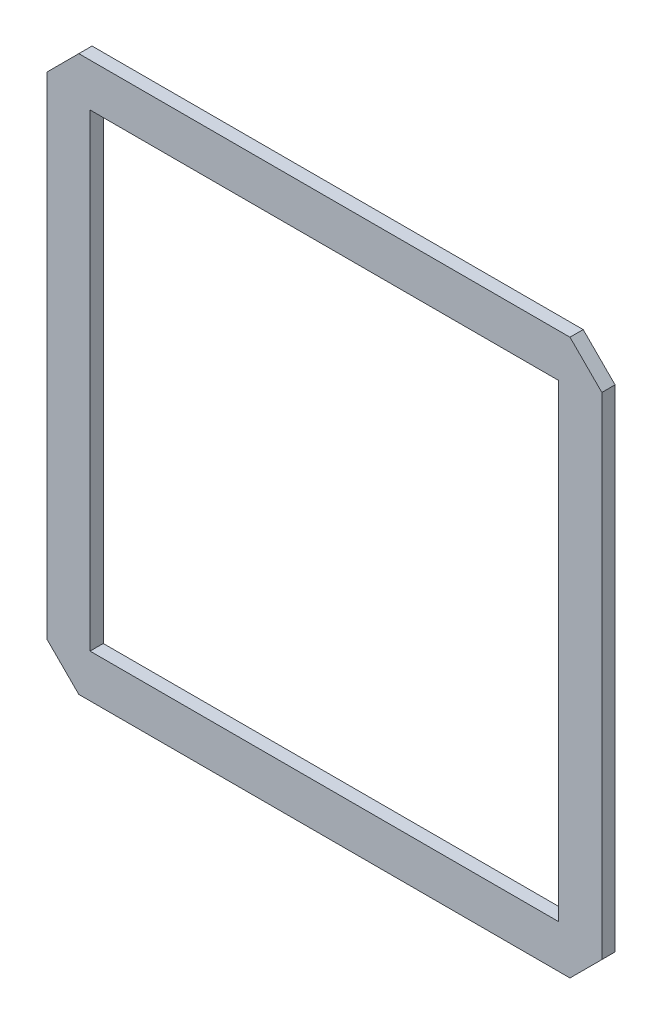
ISO-10303-21;
HEADER;
FILE_DESCRIPTION(('STEP AP214'),'2;1');
FILE_NAME('part.step','',(''),(''),'','','');
FILE_SCHEMA(('AUTOMOTIVE_DESIGN { 1 0 10303 214 1 1 1 1 }'));
ENDSEC;
DATA;
#1=APPLICATION_CONTEXT('core data for automotive mechanical design processes');
#2=APPLICATION_PROTOCOL_DEFINITION('international standard','automotive_design',2000,#1);
#3=PRODUCT_CONTEXT('',#1,'mechanical');
#4=PRODUCT('Part','Part','',(#3));
#5=PRODUCT_RELATED_PRODUCT_CATEGORY('part','',(#4));
#6=PRODUCT_DEFINITION_FORMATION('','',#4);
#7=PRODUCT_DEFINITION_CONTEXT('part definition',#1,'design');
#8=PRODUCT_DEFINITION('design','',#6,#7);
#9=PRODUCT_DEFINITION_SHAPE('','',#8);
#10=(LENGTH_UNIT() NAMED_UNIT(*) SI_UNIT(.MILLI.,.METRE.));
#11=(NAMED_UNIT(*) PLANE_ANGLE_UNIT() SI_UNIT($,.RADIAN.));
#12=(NAMED_UNIT(*) SI_UNIT($,.STERADIAN.) SOLID_ANGLE_UNIT());
#13=UNCERTAINTY_MEASURE_WITH_UNIT(LENGTH_MEASURE(1.E-05),#10,'distance_accuracy_value','');
#14=(GEOMETRIC_REPRESENTATION_CONTEXT(3) GLOBAL_UNCERTAINTY_ASSIGNED_CONTEXT((#13)) GLOBAL_UNIT_ASSIGNED_CONTEXT((#10,
#11,#12)) REPRESENTATION_CONTEXT('',''));
#15=CARTESIAN_POINT('',(0.,0.,0.));
#16=DIRECTION('',(0.,0.,1.));
#17=DIRECTION('',(1.,0.,0.));
#18=AXIS2_PLACEMENT_3D('',#15,#16,#17);
#19=CARTESIAN_POINT('',(0.,0.,3.));
#20=DIRECTION('',(0.,0.,1.));
#21=DIRECTION('',(1.,0.,0.));
#22=AXIS2_PLACEMENT_3D('',#19,#20,#21);
#23=PLANE('',#22);
#24=DIRECTION('',(-0.70710678118655,0.707106781186545,0.));
#25=VECTOR('',#24,1.);
#26=CARTESIAN_POINT('',(264.,289.7573593129,3.));
#27=LINE('',#26,#25);
#28=CARTESIAN_POINT('',(264.,289.7573593129,3.));
#29=VERTEX_POINT('',#28);
#30=CARTESIAN_POINT('',(256.7573593129,297.,3.));
#31=VERTEX_POINT('',#30);
#32=EDGE_CURVE('E159',#29,#31,#27,.T.);
#33=ORIENTED_EDGE('',*,*,#32,.T.);
#34=DIRECTION('',(-1.,0.,0.));
#35=VECTOR('',#34,1.);
#36=CARTESIAN_POINT('',(256.7573593129,297.,3.));
#37=LINE('',#36,#35);
#38=CARTESIAN_POINT('',(145.2426406871,297.,3.));
#39=VERTEX_POINT('',#38);
#40=EDGE_CURVE('E162',#31,#39,#37,.T.);
#41=ORIENTED_EDGE('',*,*,#40,.T.);
#42=DIRECTION('',(-0.707106781186549,-0.707106781186546,0.));
#43=VECTOR('',#42,1.);
#44=CARTESIAN_POINT('',(145.2426406871,297.,3.));
#45=LINE('',#44,#43);
#46=CARTESIAN_POINT('',(138.,289.7573593129,3.));
#47=VERTEX_POINT('',#46);
#48=EDGE_CURVE('E165',#39,#47,#45,.T.);
#49=ORIENTED_EDGE('',*,*,#48,.T.);
#50=DIRECTION('',(0.,-1.,0.));
#51=VECTOR('',#50,1.);
#52=CARTESIAN_POINT('',(138.,289.7573593129,3.));
#53=LINE('',#52,#51);
#54=CARTESIAN_POINT('',(138.,178.2426406871,3.));
#55=VERTEX_POINT('',#54);
#56=EDGE_CURVE('E167',#47,#55,#53,.T.);
#57=ORIENTED_EDGE('',*,*,#56,.T.);
#58=DIRECTION('',(0.707106781186548,-0.707106781186548,0.));
#59=VECTOR('',#58,1.);
#60=CARTESIAN_POINT('',(138.,178.2426406871,3.));
#61=LINE('',#60,#59);
#62=CARTESIAN_POINT('',(145.2426406871,171.,3.));
#63=VERTEX_POINT('',#62);
#64=EDGE_CURVE('E169',#55,#63,#61,.T.);
#65=ORIENTED_EDGE('',*,*,#64,.T.);
#66=DIRECTION('',(1.,0.,0.));
#67=VECTOR('',#66,1.);
#68=CARTESIAN_POINT('',(145.2426406871,171.,3.));
#69=LINE('',#68,#67);
#70=CARTESIAN_POINT('',(256.7573593129,171.,3.));
#71=VERTEX_POINT('',#70);
#72=EDGE_CURVE('E171',#63,#71,#69,.T.);
#73=ORIENTED_EDGE('',*,*,#72,.T.);
#74=DIRECTION('',(0.707106781186549,0.707106781186546,0.));
#75=VECTOR('',#74,1.);
#76=CARTESIAN_POINT('',(256.7573593129,171.,3.));
#77=LINE('',#76,#75);
#78=CARTESIAN_POINT('',(264.,178.2426406871,3.));
#79=VERTEX_POINT('',#78);
#80=EDGE_CURVE('E173',#71,#79,#77,.T.);
#81=ORIENTED_EDGE('',*,*,#80,.T.);
#82=DIRECTION('',(0.,1.,0.));
#83=VECTOR('',#82,1.);
#84=CARTESIAN_POINT('',(264.,178.2426406871,3.));
#85=LINE('',#84,#83);
#86=EDGE_CURVE('E175',#79,#29,#85,.T.);
#87=ORIENTED_EDGE('',*,*,#86,.T.);
#88=EDGE_LOOP('',(#33,#41,#49,#57,#65,#73,#81,#87));
#89=FACE_BOUND('',#88,.T.);
#90=DIRECTION('',(0.,1.,0.));
#91=VECTOR('',#90,1.);
#92=CARTESIAN_POINT('',(254.2055596209,180.7944403791,3.));
#93=LINE('',#92,#91);
#94=CARTESIAN_POINT('',(254.2055596209,180.7944403791,3.));
#95=VERTEX_POINT('',#94);
#96=CARTESIAN_POINT('',(254.2055596209,287.2055596209,3.));
#97=VERTEX_POINT('',#96);
#98=EDGE_CURVE('E131',#95,#97,#93,.T.);
#99=ORIENTED_EDGE('',*,*,#98,.F.);
#100=DIRECTION('',(1.,0.,0.));
#101=VECTOR('',#100,1.);
#102=CARTESIAN_POINT('',(147.7944403791,180.7944403791,3.));
#103=LINE('',#102,#101);
#104=CARTESIAN_POINT('',(147.7944403791,180.7944403791,3.));
#105=VERTEX_POINT('',#104);
#106=EDGE_CURVE('E123',#105,#95,#103,.T.);
#107=ORIENTED_EDGE('',*,*,#106,.F.);
#108=DIRECTION('',(0.,-1.,0.));
#109=VECTOR('',#108,1.);
#110=CARTESIAN_POINT('',(147.7944403791,287.2055596209,3.));
#111=LINE('',#110,#109);
#112=CARTESIAN_POINT('',(147.7944403791,287.2055596209,3.));
#113=VERTEX_POINT('',#112);
#114=EDGE_CURVE('E145',#113,#105,#111,.T.);
#115=ORIENTED_EDGE('',*,*,#114,.F.);
#116=DIRECTION('',(-1.,0.,0.));
#117=VECTOR('',#116,1.);
#118=CARTESIAN_POINT('',(254.2055596209,287.2055596209,3.));
#119=LINE('',#118,#117);
#120=EDGE_CURVE('E143',#97,#113,#119,.T.);
#121=ORIENTED_EDGE('',*,*,#120,.F.);
#122=EDGE_LOOP('',(#99,#107,#115,#121));
#123=FACE_BOUND('',#122,.T.);
#124=ADVANCED_FACE('F34',(#89,#123),#23,.T.);
#125=CARTESIAN_POINT('',(0.,0.,0.));
#126=DIRECTION('',(0.,0.,1.));
#127=DIRECTION('',(1.,0.,0.));
#128=AXIS2_PLACEMENT_3D('',#125,#126,#127);
#129=PLANE('',#128);
#130=DIRECTION('',(-0.70710678118655,0.707106781186545,0.));
#131=VECTOR('',#130,1.);
#132=CARTESIAN_POINT('',(264.,289.7573593129,0.));
#133=LINE('',#132,#131);
#134=CARTESIAN_POINT('',(264.,289.7573593129,0.));
#135=VERTEX_POINT('',#134);
#136=CARTESIAN_POINT('',(256.7573593129,297.,0.));
#137=VERTEX_POINT('',#136);
#138=EDGE_CURVE('E139',#135,#137,#133,.T.);
#139=ORIENTED_EDGE('',*,*,#138,.F.);
#140=DIRECTION('',(0.,1.,0.));
#141=VECTOR('',#140,1.);
#142=CARTESIAN_POINT('',(264.,178.2426406871,0.));
#143=LINE('',#142,#141);
#144=CARTESIAN_POINT('',(264.,178.2426406871,0.));
#145=VERTEX_POINT('',#144);
#146=EDGE_CURVE('E163',#145,#135,#143,.T.);
#147=ORIENTED_EDGE('',*,*,#146,.F.);
#148=DIRECTION('',(0.707106781186549,0.707106781186546,0.));
#149=VECTOR('',#148,1.);
#150=CARTESIAN_POINT('',(256.7573593129,171.,0.));
#151=LINE('',#150,#149);
#152=CARTESIAN_POINT('',(256.7573593129,171.,0.));
#153=VERTEX_POINT('',#152);
#154=EDGE_CURVE('E190',#153,#145,#151,.T.);
#155=ORIENTED_EDGE('',*,*,#154,.F.);
#156=DIRECTION('',(1.,0.,0.));
#157=VECTOR('',#156,1.);
#158=CARTESIAN_POINT('',(145.2426406871,171.,0.));
#159=LINE('',#158,#157);
#160=CARTESIAN_POINT('',(145.2426406871,171.,0.));
#161=VERTEX_POINT('',#160);
#162=EDGE_CURVE('E188',#161,#153,#159,.T.);
#163=ORIENTED_EDGE('',*,*,#162,.F.);
#164=DIRECTION('',(0.707106781186548,-0.707106781186548,0.));
#165=VECTOR('',#164,1.);
#166=CARTESIAN_POINT('',(138.,178.2426406871,0.));
#167=LINE('',#166,#165);
#168=CARTESIAN_POINT('',(138.,178.2426406871,0.));
#169=VERTEX_POINT('',#168);
#170=EDGE_CURVE('E186',#169,#161,#167,.T.);
#171=ORIENTED_EDGE('',*,*,#170,.F.);
#172=DIRECTION('',(0.,-1.,0.));
#173=VECTOR('',#172,1.);
#174=CARTESIAN_POINT('',(138.,289.7573593129,0.));
#175=LINE('',#174,#173);
#176=CARTESIAN_POINT('',(138.,289.7573593129,0.));
#177=VERTEX_POINT('',#176);
#178=EDGE_CURVE('E184',#177,#169,#175,.T.);
#179=ORIENTED_EDGE('',*,*,#178,.F.);
#180=DIRECTION('',(-0.707106781186549,-0.707106781186546,0.));
#181=VECTOR('',#180,1.);
#182=CARTESIAN_POINT('',(145.2426406871,297.,0.));
#183=LINE('',#182,#181);
#184=CARTESIAN_POINT('',(145.2426406871,297.,0.));
#185=VERTEX_POINT('',#184);
#186=EDGE_CURVE('E182',#185,#177,#183,.T.);
#187=ORIENTED_EDGE('',*,*,#186,.F.);
#188=DIRECTION('',(-1.,0.,0.));
#189=VECTOR('',#188,1.);
#190=CARTESIAN_POINT('',(256.7573593129,297.,0.));
#191=LINE('',#190,#189);
#192=EDGE_CURVE('E180',#137,#185,#191,.T.);
#193=ORIENTED_EDGE('',*,*,#192,.F.);
#194=EDGE_LOOP('',(#139,#147,#155,#163,#171,#179,#187,#193));
#195=FACE_BOUND('',#194,.T.);
#196=DIRECTION('',(1.,0.,0.));
#197=VECTOR('',#196,1.);
#198=CARTESIAN_POINT('',(147.7944403791,180.7944403791,0.));
#199=LINE('',#198,#197);
#200=CARTESIAN_POINT('',(147.7944403791,180.7944403791,0.));
#201=VERTEX_POINT('',#200);
#202=CARTESIAN_POINT('',(254.2055596209,180.7944403791,0.));
#203=VERTEX_POINT('',#202);
#204=EDGE_CURVE('E57',#201,#203,#199,.T.);
#205=ORIENTED_EDGE('',*,*,#204,.T.);
#206=DIRECTION('',(0.,1.,0.));
#207=VECTOR('',#206,1.);
#208=CARTESIAN_POINT('',(254.2055596209,180.7944403791,0.));
#209=LINE('',#208,#207);
#210=CARTESIAN_POINT('',(254.2055596209,287.2055596209,0.));
#211=VERTEX_POINT('',#210);
#212=EDGE_CURVE('E138',#203,#211,#209,.T.);
#213=ORIENTED_EDGE('',*,*,#212,.T.);
#214=DIRECTION('',(-1.,0.,0.));
#215=VECTOR('',#214,1.);
#216=CARTESIAN_POINT('',(254.2055596209,287.2055596209,0.));
#217=LINE('',#216,#215);
#218=CARTESIAN_POINT('',(147.7944403791,287.2055596209,0.));
#219=VERTEX_POINT('',#218);
#220=EDGE_CURVE('E151',#211,#219,#217,.T.);
#221=ORIENTED_EDGE('',*,*,#220,.T.);
#222=DIRECTION('',(0.,-1.,0.));
#223=VECTOR('',#222,1.);
#224=CARTESIAN_POINT('',(147.7944403791,287.2055596209,0.));
#225=LINE('',#224,#223);
#226=EDGE_CURVE('E132',#219,#201,#225,.T.);
#227=ORIENTED_EDGE('',*,*,#226,.T.);
#228=EDGE_LOOP('',(#205,#213,#221,#227));
#229=FACE_BOUND('',#228,.T.);
#230=ADVANCED_FACE('F220',(#195,#229),#129,.F.);
#231=CARTESIAN_POINT('',(264.,289.7573593129,3.));
#232=DIRECTION('',(-0.707106781186545,-0.70710678118655,0.));
#233=DIRECTION('',(0.70710678118655,-0.707106781186545,0.));
#234=AXIS2_PLACEMENT_3D('',#231,#232,#233);
#235=PLANE('',#234);
#236=ORIENTED_EDGE('',*,*,#138,.T.);
#237=DIRECTION('',(0.,0.,-1.));
#238=VECTOR('',#237,1.);
#239=CARTESIAN_POINT('',(256.7573593129,297.,3.));
#240=LINE('',#239,#238);
#241=EDGE_CURVE('E11',#31,#137,#240,.T.);
#242=ORIENTED_EDGE('',*,*,#241,.F.);
#243=ORIENTED_EDGE('',*,*,#32,.F.);
#244=DIRECTION('',(0.,0.,-1.));
#245=VECTOR('',#244,1.);
#246=CARTESIAN_POINT('',(264.,289.7573593129,3.));
#247=LINE('',#246,#245);
#248=EDGE_CURVE('E177',#29,#135,#247,.T.);
#249=ORIENTED_EDGE('',*,*,#248,.T.);
#250=EDGE_LOOP('',(#236,#242,#243,#249));
#251=FACE_BOUND('',#250,.T.);
#252=ADVANCED_FACE('F36',(#251),#235,.F.);
#253=CARTESIAN_POINT('',(256.7573593129,297.,3.));
#254=DIRECTION('',(0.,-1.,0.));
#255=DIRECTION('',(0.,0.,-1.));
#256=AXIS2_PLACEMENT_3D('',#253,#254,#255);
#257=PLANE('',#256);
#258=ORIENTED_EDGE('',*,*,#192,.T.);
#259=DIRECTION('',(0.,0.,-1.));
#260=VECTOR('',#259,1.);
#261=CARTESIAN_POINT('',(145.2426406871,297.,3.));
#262=LINE('',#261,#260);
#263=EDGE_CURVE('E42',#39,#185,#262,.T.);
#264=ORIENTED_EDGE('',*,*,#263,.F.);
#265=ORIENTED_EDGE('',*,*,#40,.F.);
#266=ORIENTED_EDGE('',*,*,#241,.T.);
#267=EDGE_LOOP('',(#258,#264,#265,#266));
#268=FACE_BOUND('',#267,.T.);
#269=ADVANCED_FACE('F237',(#268),#257,.F.);
#270=CARTESIAN_POINT('',(145.2426406871,297.,3.));
#271=DIRECTION('',(0.707106781186546,-0.707106781186549,0.));
#272=DIRECTION('',(0.707106781186549,0.707106781186546,0.));
#273=AXIS2_PLACEMENT_3D('',#270,#271,#272);
#274=PLANE('',#273);
#275=ORIENTED_EDGE('',*,*,#186,.T.);
#276=DIRECTION('',(0.,0.,-1.));
#277=VECTOR('',#276,1.);
#278=CARTESIAN_POINT('',(138.,289.7573593129,3.));
#279=LINE('',#278,#277);
#280=EDGE_CURVE('E207',#47,#177,#279,.T.);
#281=ORIENTED_EDGE('',*,*,#280,.F.);
#282=ORIENTED_EDGE('',*,*,#48,.F.);
#283=ORIENTED_EDGE('',*,*,#263,.T.);
#284=EDGE_LOOP('',(#275,#281,#282,#283));
#285=FACE_BOUND('',#284,.T.);
#286=ADVANCED_FACE('F214',(#285),#274,.F.);
#287=CARTESIAN_POINT('',(138.,289.7573593129,3.));
#288=DIRECTION('',(1.,0.,0.));
#289=DIRECTION('',(0.,0.,-1.));
#290=AXIS2_PLACEMENT_3D('',#287,#288,#289);
#291=PLANE('',#290);
#292=ORIENTED_EDGE('',*,*,#178,.T.);
#293=DIRECTION('',(0.,0.,-1.));
#294=VECTOR('',#293,1.);
#295=CARTESIAN_POINT('',(138.,178.2426406871,3.));
#296=LINE('',#295,#294);
#297=EDGE_CURVE('E204',#55,#169,#296,.T.);
#298=ORIENTED_EDGE('',*,*,#297,.F.);
#299=ORIENTED_EDGE('',*,*,#56,.F.);
#300=ORIENTED_EDGE('',*,*,#280,.T.);
#301=EDGE_LOOP('',(#292,#298,#299,#300));
#302=FACE_BOUND('',#301,.T.);
#303=ADVANCED_FACE('F226',(#302),#291,.F.);
#304=CARTESIAN_POINT('',(138.,178.2426406871,3.));
#305=DIRECTION('',(0.707106781186547,0.707106781186547,0.));
#306=DIRECTION('',(-0.707106781186548,0.707106781186548,0.));
#307=AXIS2_PLACEMENT_3D('',#304,#305,#306);
#308=PLANE('',#307);
#309=ORIENTED_EDGE('',*,*,#170,.T.);
#310=DIRECTION('',(0.,0.,-1.));
#311=VECTOR('',#310,1.);
#312=CARTESIAN_POINT('',(145.2426406871,171.,3.));
#313=LINE('',#312,#311);
#314=EDGE_CURVE('E201',#63,#161,#313,.T.);
#315=ORIENTED_EDGE('',*,*,#314,.F.);
#316=ORIENTED_EDGE('',*,*,#64,.F.);
#317=ORIENTED_EDGE('',*,*,#297,.T.);
#318=EDGE_LOOP('',(#309,#315,#316,#317));
#319=FACE_BOUND('',#318,.T.);
#320=ADVANCED_FACE('F230',(#319),#308,.F.);
#321=CARTESIAN_POINT('',(145.2426406871,171.,3.));
#322=DIRECTION('',(0.,1.,0.));
#323=DIRECTION('',(0.,0.,1.));
#324=AXIS2_PLACEMENT_3D('',#321,#322,#323);
#325=PLANE('',#324);
#326=ORIENTED_EDGE('',*,*,#162,.T.);
#327=DIRECTION('',(0.,0.,-1.));
#328=VECTOR('',#327,1.);
#329=CARTESIAN_POINT('',(256.7573593129,171.,3.));
#330=LINE('',#329,#328);
#331=EDGE_CURVE('E198',#71,#153,#330,.T.);
#332=ORIENTED_EDGE('',*,*,#331,.F.);
#333=ORIENTED_EDGE('',*,*,#72,.F.);
#334=ORIENTED_EDGE('',*,*,#314,.T.);
#335=EDGE_LOOP('',(#326,#332,#333,#334));
#336=FACE_BOUND('',#335,.T.);
#337=ADVANCED_FACE('F250',(#336),#325,.F.);
#338=CARTESIAN_POINT('',(256.7573593129,171.,3.));
#339=DIRECTION('',(-0.707106781186546,0.707106781186549,0.));
#340=DIRECTION('',(-0.707106781186549,-0.707106781186546,0.));
#341=AXIS2_PLACEMENT_3D('',#338,#339,#340);
#342=PLANE('',#341);
#343=ORIENTED_EDGE('',*,*,#154,.T.);
#344=DIRECTION('',(0.,0.,-1.));
#345=VECTOR('',#344,1.);
#346=CARTESIAN_POINT('',(264.,178.2426406871,3.));
#347=LINE('',#346,#345);
#348=EDGE_CURVE('E195',#79,#145,#347,.T.);
#349=ORIENTED_EDGE('',*,*,#348,.F.);
#350=ORIENTED_EDGE('',*,*,#80,.F.);
#351=ORIENTED_EDGE('',*,*,#331,.T.);
#352=EDGE_LOOP('',(#343,#349,#350,#351));
#353=FACE_BOUND('',#352,.T.);
#354=ADVANCED_FACE('F248',(#353),#342,.F.);
#355=CARTESIAN_POINT('',(264.,178.2426406871,3.));
#356=DIRECTION('',(-1.,0.,0.));
#357=DIRECTION('',(0.,0.,1.));
#358=AXIS2_PLACEMENT_3D('',#355,#356,#357);
#359=PLANE('',#358);
#360=ORIENTED_EDGE('',*,*,#146,.T.);
#361=ORIENTED_EDGE('',*,*,#248,.F.);
#362=ORIENTED_EDGE('',*,*,#86,.F.);
#363=ORIENTED_EDGE('',*,*,#348,.T.);
#364=EDGE_LOOP('',(#360,#361,#362,#363));
#365=FACE_BOUND('',#364,.T.);
#366=ADVANCED_FACE('F243',(#365),#359,.F.);
#367=CARTESIAN_POINT('',(147.7944403791,180.7944403791,3.));
#368=DIRECTION('',(0.,1.,0.));
#369=DIRECTION('',(0.,0.,1.));
#370=AXIS2_PLACEMENT_3D('',#367,#368,#369);
#371=PLANE('',#370);
#372=ORIENTED_EDGE('',*,*,#204,.F.);
#373=DIRECTION('',(0.,0.,-1.));
#374=VECTOR('',#373,1.);
#375=CARTESIAN_POINT('',(147.7944403791,180.7944403791,3.));
#376=LINE('',#375,#374);
#377=EDGE_CURVE('E127',#105,#201,#376,.T.);
#378=ORIENTED_EDGE('',*,*,#377,.F.);
#379=ORIENTED_EDGE('',*,*,#106,.T.);
#380=DIRECTION('',(0.,0.,-1.));
#381=VECTOR('',#380,1.);
#382=CARTESIAN_POINT('',(254.2055596209,180.7944403791,3.));
#383=LINE('',#382,#381);
#384=EDGE_CURVE('E126',#95,#203,#383,.T.);
#385=ORIENTED_EDGE('',*,*,#384,.T.);
#386=EDGE_LOOP('',(#372,#378,#379,#385));
#387=FACE_BOUND('',#386,.T.);
#388=ADVANCED_FACE('F125',(#387),#371,.T.);
#389=CARTESIAN_POINT('',(254.2055596209,180.7944403791,3.));
#390=DIRECTION('',(-1.,0.,0.));
#391=DIRECTION('',(0.,0.,1.));
#392=AXIS2_PLACEMENT_3D('',#389,#390,#391);
#393=PLANE('',#392);
#394=ORIENTED_EDGE('',*,*,#212,.F.);
#395=ORIENTED_EDGE('',*,*,#384,.F.);
#396=ORIENTED_EDGE('',*,*,#98,.T.);
#397=DIRECTION('',(0.,0.,-1.));
#398=VECTOR('',#397,1.);
#399=CARTESIAN_POINT('',(254.2055596209,287.2055596209,3.));
#400=LINE('',#399,#398);
#401=EDGE_CURVE('E140',#97,#211,#400,.T.);
#402=ORIENTED_EDGE('',*,*,#401,.T.);
#403=EDGE_LOOP('',(#394,#395,#396,#402));
#404=FACE_BOUND('',#403,.T.);
#405=ADVANCED_FACE('F135',(#404),#393,.T.);
#406=CARTESIAN_POINT('',(254.2055596209,287.2055596209,3.));
#407=DIRECTION('',(0.,-1.,0.));
#408=DIRECTION('',(0.,0.,-1.));
#409=AXIS2_PLACEMENT_3D('',#406,#407,#408);
#410=PLANE('',#409);
#411=ORIENTED_EDGE('',*,*,#220,.F.);
#412=ORIENTED_EDGE('',*,*,#401,.F.);
#413=ORIENTED_EDGE('',*,*,#120,.T.);
#414=DIRECTION('',(0.,0.,-1.));
#415=VECTOR('',#414,1.);
#416=CARTESIAN_POINT('',(147.7944403791,287.2055596209,3.));
#417=LINE('',#416,#415);
#418=EDGE_CURVE('E49',#113,#219,#417,.T.);
#419=ORIENTED_EDGE('',*,*,#418,.T.);
#420=EDGE_LOOP('',(#411,#412,#413,#419));
#421=FACE_BOUND('',#420,.T.);
#422=ADVANCED_FACE('F275',(#421),#410,.T.);
#423=CARTESIAN_POINT('',(147.7944403791,287.2055596209,3.));
#424=DIRECTION('',(1.,0.,0.));
#425=DIRECTION('',(0.,0.,-1.));
#426=AXIS2_PLACEMENT_3D('',#423,#424,#425);
#427=PLANE('',#426);
#428=ORIENTED_EDGE('',*,*,#226,.F.);
#429=ORIENTED_EDGE('',*,*,#418,.F.);
#430=ORIENTED_EDGE('',*,*,#114,.T.);
#431=ORIENTED_EDGE('',*,*,#377,.T.);
#432=EDGE_LOOP('',(#428,#429,#430,#431));
#433=FACE_BOUND('',#432,.T.);
#434=ADVANCED_FACE('F279',(#433),#427,.T.);
#435=CLOSED_SHELL('',(#124,#230,#252,#269,#286,#303,#320,#337,#354,#366,#388,#405,#422,#434));
#436=MANIFOLD_SOLID_BREP('B2',#435);
#437=ADVANCED_BREP_SHAPE_REPRESENTATION('',(#18,#436),#14);
#438=SHAPE_DEFINITION_REPRESENTATION(#9,#437);
ENDSEC;
END-ISO-10303-21;
